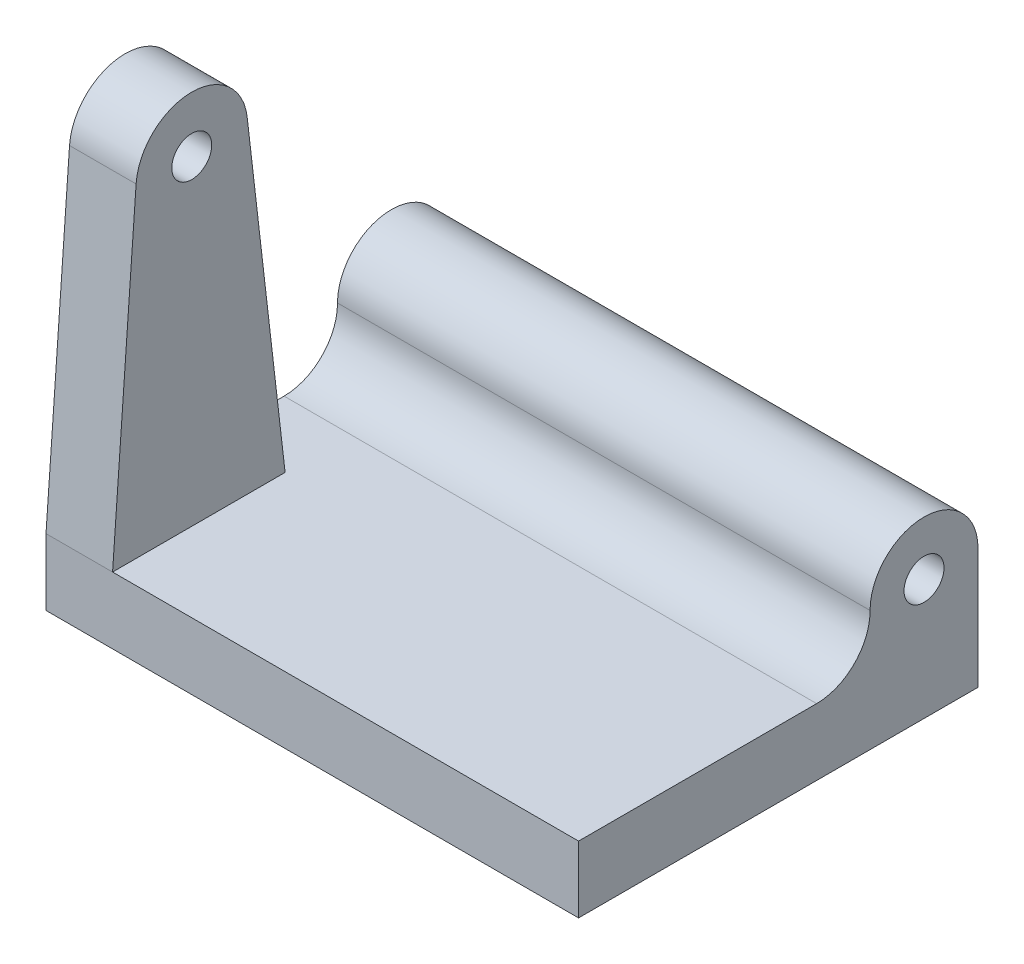
ISO-10303-21;
HEADER;
FILE_DESCRIPTION(('STEP AP214'),'2;1');
FILE_NAME('part.step','',(''),(''),'','','');
FILE_SCHEMA(('AUTOMOTIVE_DESIGN { 1 0 10303 214 1 1 1 1 }'));
ENDSEC;
DATA;
#1=APPLICATION_CONTEXT('core data for automotive mechanical design processes');
#2=APPLICATION_PROTOCOL_DEFINITION('international standard','automotive_design',2000,#1);
#3=PRODUCT_CONTEXT('',#1,'mechanical');
#4=PRODUCT('Part','Part','',(#3));
#5=PRODUCT_RELATED_PRODUCT_CATEGORY('part','',(#4));
#6=PRODUCT_DEFINITION_FORMATION('','',#4);
#7=PRODUCT_DEFINITION_CONTEXT('part definition',#1,'design');
#8=PRODUCT_DEFINITION('design','',#6,#7);
#9=PRODUCT_DEFINITION_SHAPE('','',#8);
#10=(LENGTH_UNIT() NAMED_UNIT(*) SI_UNIT(.MILLI.,.METRE.));
#11=(NAMED_UNIT(*) PLANE_ANGLE_UNIT() SI_UNIT($,.RADIAN.));
#12=(NAMED_UNIT(*) SI_UNIT($,.STERADIAN.) SOLID_ANGLE_UNIT());
#13=UNCERTAINTY_MEASURE_WITH_UNIT(LENGTH_MEASURE(1.E-05),#10,'distance_accuracy_value','');
#14=(GEOMETRIC_REPRESENTATION_CONTEXT(3) GLOBAL_UNCERTAINTY_ASSIGNED_CONTEXT((#13)) GLOBAL_UNIT_ASSIGNED_CONTEXT((#10,
#11,#12)) REPRESENTATION_CONTEXT('',''));
#15=CARTESIAN_POINT('',(0.,0.,0.));
#16=DIRECTION('',(0.,0.,1.));
#17=DIRECTION('',(1.,0.,0.));
#18=AXIS2_PLACEMENT_3D('',#15,#16,#17);
#19=CARTESIAN_POINT('',(0.,5.,0.));
#20=DIRECTION('',(0.,1.,0.));
#21=DIRECTION('',(0.,0.,1.));
#22=AXIS2_PLACEMENT_3D('',#19,#20,#21);
#23=PLANE('',#22);
#24=DIRECTION('',(-1.,0.,0.));
#25=VECTOR('',#24,1.);
#26=CARTESIAN_POINT('',(5.,5.,17.0414628370139));
#27=LINE('',#26,#25);
#28=CARTESIAN_POINT('',(5.,5.,17.0414628370139));
#29=VERTEX_POINT('',#28);
#30=CARTESIAN_POINT('',(0.,5.,17.0414628370139));
#31=VERTEX_POINT('',#30);
#32=EDGE_CURVE('E52',#29,#31,#27,.T.);
#33=ORIENTED_EDGE('',*,*,#32,.F.);
#34=DIRECTION('',(0.,0.,1.));
#35=VECTOR('',#34,1.);
#36=CARTESIAN_POINT('',(5.,5.,17.0414628370139));
#37=LINE('',#36,#35);
#38=CARTESIAN_POINT('',(5.,5.,30.));
#39=VERTEX_POINT('',#38);
#40=EDGE_CURVE('E119',#29,#39,#37,.T.);
#41=ORIENTED_EDGE('',*,*,#40,.T.);
#42=DIRECTION('',(1.,0.,0.));
#43=VECTOR('',#42,1.);
#44=CARTESIAN_POINT('',(0.,5.,30.));
#45=LINE('',#44,#43);
#46=CARTESIAN_POINT('',(40.,5.,30.));
#47=VERTEX_POINT('',#46);
#48=EDGE_CURVE('E110',#39,#47,#45,.T.);
#49=ORIENTED_EDGE('',*,*,#48,.T.);
#50=DIRECTION('',(0.,0.,-1.));
#51=VECTOR('',#50,1.);
#52=CARTESIAN_POINT('',(40.,5.,0.));
#53=LINE('',#52,#51);
#54=CARTESIAN_POINT('',(40.,5.,12.1169309093559));
#55=VERTEX_POINT('',#54);
#56=EDGE_CURVE('E133',#47,#55,#53,.T.);
#57=ORIENTED_EDGE('',*,*,#56,.T.);
#58=DIRECTION('',(-1.,0.,0.));
#59=VECTOR('',#58,1.);
#60=CARTESIAN_POINT('',(40.,5.,12.1169309093559));
#61=LINE('',#60,#59);
#62=CARTESIAN_POINT('',(0.,5.,12.1169309093559));
#63=VERTEX_POINT('',#62);
#64=EDGE_CURVE('E176',#55,#63,#61,.T.);
#65=ORIENTED_EDGE('',*,*,#64,.T.);
#66=DIRECTION('',(0.,0.,1.));
#67=VECTOR('',#66,1.);
#68=CARTESIAN_POINT('',(0.,5.,0.));
#69=LINE('',#68,#67);
#70=EDGE_CURVE('E57',#63,#31,#69,.T.);
#71=ORIENTED_EDGE('',*,*,#70,.T.);
#72=EDGE_LOOP('',(#33,#41,#49,#57,#65,#71));
#73=FACE_BOUND('',#72,.T.);
#74=ADVANCED_FACE('F35',(#73),#23,.T.);
#75=CARTESIAN_POINT('',(0.,5.,0.));
#76=DIRECTION('',(1.,0.,0.));
#77=DIRECTION('',(0.,0.,-1.));
#78=AXIS2_PLACEMENT_3D('',#75,#76,#77);
#79=PLANE('',#78);
#80=DIRECTION('',(0.,0.,1.));
#81=VECTOR('',#80,1.);
#82=CARTESIAN_POINT('',(0.,0.,0.));
#83=LINE('',#82,#81);
#84=CARTESIAN_POINT('',(0.,0.,0.));
#85=VERTEX_POINT('',#84);
#86=CARTESIAN_POINT('',(0.,0.,30.));
#87=VERTEX_POINT('',#86);
#88=EDGE_CURVE('E178',#85,#87,#83,.T.);
#89=ORIENTED_EDGE('',*,*,#88,.T.);
#90=DIRECTION('',(0.,-1.,0.));
#91=VECTOR('',#90,1.);
#92=CARTESIAN_POINT('',(0.,5.,30.));
#93=LINE('',#92,#91);
#94=CARTESIAN_POINT('',(0.,5.,30.));
#95=VERTEX_POINT('',#94);
#96=EDGE_CURVE('E11',#95,#87,#93,.T.);
#97=ORIENTED_EDGE('',*,*,#96,.F.);
#98=DIRECTION('',(0.,0.997378081158189,-0.0723668655201374));
#99=VECTOR('',#98,1.);
#100=CARTESIAN_POINT('',(0.,5.,30.));
#101=LINE('',#100,#99);
#102=CARTESIAN_POINT('',(0.,29.3577172886557,28.232674564736));
#103=VERTEX_POINT('',#102);
#104=EDGE_CURVE('E132',#95,#103,#101,.T.);
#105=ORIENTED_EDGE('',*,*,#104,.T.);
#106=CARTESIAN_POINT('',(0.,29.0544773857611,24.0533470464607));
#107=DIRECTION('',(-1.,0.,0.));
#108=DIRECTION('',(0.,0.,1.));
#109=AXIS2_PLACEMENT_3D('',#106,#107,#108);
#110=CIRCLE('',#109,4.19031418198219);
#111=CARTESIAN_POINT('',(0.,29.5378437926571,19.8910051743404));
#112=VERTEX_POINT('',#111);
#113=EDGE_CURVE('E146',#103,#112,#110,.T.);
#114=ORIENTED_EDGE('',*,*,#113,.T.);
#115=DIRECTION('',(0.,-0.993324531610965,-0.115353261331686));
#116=VECTOR('',#115,1.);
#117=CARTESIAN_POINT('',(0.,29.5378437926571,19.8910051743404));
#118=LINE('',#117,#116);
#119=EDGE_CURVE('E125',#112,#31,#118,.T.);
#120=ORIENTED_EDGE('',*,*,#119,.T.);
#121=ORIENTED_EDGE('',*,*,#70,.F.);
#122=CARTESIAN_POINT('',(0.,9.03235710109781,12.1390511940191));
#123=DIRECTION('',(-1.,0.,0.));
#124=DIRECTION('',(0.,0.,1.));
#125=AXIS2_PLACEMENT_3D('',#122,#123,#124);
#126=CIRCLE('',#125,4.03241777321839);
#127=CARTESIAN_POINT('',(0.,9.05447738576114,8.10669409292134));
#128=VERTEX_POINT('',#127);
#129=EDGE_CURVE('E153',#128,#63,#126,.T.);
#130=ORIENTED_EDGE('',*,*,#129,.F.);
#131=CARTESIAN_POINT('',(0.,9.05447738576107,4.05334704646067));
#132=DIRECTION('',(-1.,0.,0.));
#133=DIRECTION('',(0.,0.,1.));
#134=AXIS2_PLACEMENT_3D('',#131,#132,#133);
#135=CIRCLE('',#134,4.05334704646067);
#136=CARTESIAN_POINT('',(0.,9.05447738576107,0.));
#137=VERTEX_POINT('',#136);
#138=EDGE_CURVE('E165',#128,#137,#135,.T.);
#139=ORIENTED_EDGE('',*,*,#138,.T.);
#140=DIRECTION('',(0.,-1.,0.));
#141=VECTOR('',#140,1.);
#142=CARTESIAN_POINT('',(0.,5.,0.));
#143=LINE('',#142,#141);
#144=EDGE_CURVE('E190',#137,#85,#143,.T.);
#145=ORIENTED_EDGE('',*,*,#144,.T.);
#146=EDGE_LOOP('',(#89,#97,#105,#114,#120,#121,#130,#139,#145));
#147=FACE_BOUND('',#146,.T.);
#148=CARTESIAN_POINT('',(0.,9.05447738576107,4.05334704646067));
#149=DIRECTION('',(-1.,0.,0.));
#150=DIRECTION('',(0.,0.,1.));
#151=AXIS2_PLACEMENT_3D('',#148,#149,#150);
#152=CIRCLE('',#151,1.5);
#153=CARTESIAN_POINT('',(0.,9.05447738576107,5.55334704646067));
#154=VERTEX_POINT('',#153);
#155=EDGE_CURVE('E168',#154,#154,#152,.T.);
#156=ORIENTED_EDGE('',*,*,#155,.F.);
#157=EDGE_LOOP('',(#156));
#158=FACE_BOUND('',#157,.T.);
#159=CARTESIAN_POINT('',(0.,29.0544773857611,24.0533470464607));
#160=DIRECTION('',(-1.,0.,0.));
#161=DIRECTION('',(0.,0.,1.));
#162=AXIS2_PLACEMENT_3D('',#159,#160,#161);
#163=CIRCLE('',#162,1.5);
#164=CARTESIAN_POINT('',(0.,29.0544773857611,25.5533470464607));
#165=VERTEX_POINT('',#164);
#166=EDGE_CURVE('E345',#165,#165,#163,.T.);
#167=ORIENTED_EDGE('',*,*,#166,.F.);
#168=EDGE_LOOP('',(#167));
#169=FACE_BOUND('',#168,.T.);
#170=ADVANCED_FACE('F37',(#147,#158,#169),#79,.F.);
#171=CARTESIAN_POINT('',(0.,5.,30.));
#172=DIRECTION('',(0.,0.,-1.));
#173=DIRECTION('',(-1.,0.,0.));
#174=AXIS2_PLACEMENT_3D('',#171,#172,#173);
#175=PLANE('',#174);
#176=DIRECTION('',(1.,0.,0.));
#177=VECTOR('',#176,1.);
#178=CARTESIAN_POINT('',(0.,0.,30.));
#179=LINE('',#178,#177);
#180=CARTESIAN_POINT('',(40.,0.,30.));
#181=VERTEX_POINT('',#180);
#182=EDGE_CURVE('E202',#87,#181,#179,.T.);
#183=ORIENTED_EDGE('',*,*,#182,.T.);
#184=DIRECTION('',(0.,-1.,0.));
#185=VECTOR('',#184,1.);
#186=CARTESIAN_POINT('',(40.,5.,30.));
#187=LINE('',#186,#185);
#188=EDGE_CURVE('E44',#47,#181,#187,.T.);
#189=ORIENTED_EDGE('',*,*,#188,.F.);
#190=ORIENTED_EDGE('',*,*,#48,.F.);
#191=EDGE_CURVE('E113',#95,#39,#45,.T.);
#192=ORIENTED_EDGE('',*,*,#191,.F.);
#193=ORIENTED_EDGE('',*,*,#96,.T.);
#194=EDGE_LOOP('',(#183,#189,#190,#192,#193));
#195=FACE_BOUND('',#194,.T.);
#196=ADVANCED_FACE('F111',(#195),#175,.F.);
#197=CARTESIAN_POINT('',(40.,5.,0.));
#198=DIRECTION('',(-1.,0.,0.));
#199=DIRECTION('',(0.,0.,1.));
#200=AXIS2_PLACEMENT_3D('',#197,#198,#199);
#201=PLANE('',#200);
#202=DIRECTION('',(0.,0.,-1.));
#203=VECTOR('',#202,1.);
#204=CARTESIAN_POINT('',(40.,0.,0.));
#205=LINE('',#204,#203);
#206=CARTESIAN_POINT('',(40.,0.,0.));
#207=VERTEX_POINT('',#206);
#208=EDGE_CURVE('E204',#181,#207,#205,.T.);
#209=ORIENTED_EDGE('',*,*,#208,.T.);
#210=DIRECTION('',(0.,-1.,0.));
#211=VECTOR('',#210,1.);
#212=CARTESIAN_POINT('',(40.,5.,0.));
#213=LINE('',#212,#211);
#214=CARTESIAN_POINT('',(40.,9.05447738576107,0.));
#215=VERTEX_POINT('',#214);
#216=EDGE_CURVE('E193',#215,#207,#213,.T.);
#217=ORIENTED_EDGE('',*,*,#216,.F.);
#218=CARTESIAN_POINT('',(40.,9.05447738576107,4.05334704646067));
#219=DIRECTION('',(-1.,0.,0.));
#220=DIRECTION('',(0.,0.,1.));
#221=AXIS2_PLACEMENT_3D('',#218,#219,#220);
#222=CIRCLE('',#221,4.05334704646067);
#223=CARTESIAN_POINT('',(40.,9.05447738576114,8.10669409292134));
#224=VERTEX_POINT('',#223);
#225=EDGE_CURVE('E157',#224,#215,#222,.T.);
#226=ORIENTED_EDGE('',*,*,#225,.F.);
#227=CARTESIAN_POINT('',(40.,9.03235710109781,12.1390511940191));
#228=DIRECTION('',(-1.,0.,0.));
#229=DIRECTION('',(0.,0.,1.));
#230=AXIS2_PLACEMENT_3D('',#227,#228,#229);
#231=CIRCLE('',#230,4.03241777321839);
#232=EDGE_CURVE('E161',#224,#55,#231,.T.);
#233=ORIENTED_EDGE('',*,*,#232,.T.);
#234=ORIENTED_EDGE('',*,*,#56,.F.);
#235=ORIENTED_EDGE('',*,*,#188,.T.);
#236=EDGE_LOOP('',(#209,#217,#226,#233,#234,#235));
#237=FACE_BOUND('',#236,.T.);
#238=CARTESIAN_POINT('',(40.,9.05447738576107,4.05334704646067));
#239=DIRECTION('',(-1.,0.,0.));
#240=DIRECTION('',(0.,0.,1.));
#241=AXIS2_PLACEMENT_3D('',#238,#239,#240);
#242=CIRCLE('',#241,1.5);
#243=CARTESIAN_POINT('',(40.,9.05447738576107,5.55334704646067));
#244=VERTEX_POINT('',#243);
#245=EDGE_CURVE('E160',#244,#244,#242,.T.);
#246=ORIENTED_EDGE('',*,*,#245,.T.);
#247=EDGE_LOOP('',(#246));
#248=FACE_BOUND('',#247,.T.);
#249=ADVANCED_FACE('F185',(#237,#248),#201,.F.);
#250=CARTESIAN_POINT('',(0.,5.,0.));
#251=DIRECTION('',(0.,0.,1.));
#252=DIRECTION('',(1.,0.,0.));
#253=AXIS2_PLACEMENT_3D('',#250,#251,#252);
#254=PLANE('',#253);
#255=DIRECTION('',(-1.,0.,0.));
#256=VECTOR('',#255,1.);
#257=CARTESIAN_POINT('',(0.,0.,0.));
#258=LINE('',#257,#256);
#259=EDGE_CURVE('E206',#207,#85,#258,.T.);
#260=ORIENTED_EDGE('',*,*,#259,.T.);
#261=ORIENTED_EDGE('',*,*,#144,.F.);
#262=DIRECTION('',(-1.,0.,0.));
#263=VECTOR('',#262,1.);
#264=CARTESIAN_POINT('',(40.,9.05447738576107,0.));
#265=LINE('',#264,#263);
#266=EDGE_CURVE('E173',#215,#137,#265,.T.);
#267=ORIENTED_EDGE('',*,*,#266,.F.);
#268=ORIENTED_EDGE('',*,*,#216,.T.);
#269=EDGE_LOOP('',(#260,#261,#267,#268));
#270=FACE_BOUND('',#269,.T.);
#271=ADVANCED_FACE('F216',(#270),#254,.F.);
#272=CARTESIAN_POINT('',(0.,0.,0.));
#273=DIRECTION('',(0.,1.,0.));
#274=DIRECTION('',(0.,0.,1.));
#275=AXIS2_PLACEMENT_3D('',#272,#273,#274);
#276=PLANE('',#275);
#277=ORIENTED_EDGE('',*,*,#88,.F.);
#278=ORIENTED_EDGE('',*,*,#259,.F.);
#279=ORIENTED_EDGE('',*,*,#208,.F.);
#280=ORIENTED_EDGE('',*,*,#182,.F.);
#281=EDGE_LOOP('',(#277,#278,#279,#280));
#282=FACE_BOUND('',#281,.T.);
#283=ADVANCED_FACE('F214',(#282),#276,.F.);
#284=CARTESIAN_POINT('',(40.,9.03235710109781,12.1390511940191));
#285=DIRECTION('',(-1.,0.,0.));
#286=DIRECTION('',(0.,0.,1.));
#287=AXIS2_PLACEMENT_3D('',#284,#285,#286);
#288=CYLINDRICAL_SURFACE('',#287,4.03241777321839);
#289=ORIENTED_EDGE('',*,*,#129,.T.);
#290=ORIENTED_EDGE('',*,*,#64,.F.);
#291=ORIENTED_EDGE('',*,*,#232,.F.);
#292=DIRECTION('',(-1.,0.,0.));
#293=VECTOR('',#292,1.);
#294=CARTESIAN_POINT('',(40.,9.05447738576114,8.10669409292134));
#295=LINE('',#294,#293);
#296=EDGE_CURVE('E164',#224,#128,#295,.T.);
#297=ORIENTED_EDGE('',*,*,#296,.T.);
#298=EDGE_LOOP('',(#289,#290,#291,#297));
#299=FACE_BOUND('',#298,.T.);
#300=ADVANCED_FACE('F188',(#299),#288,.F.);
#301=CARTESIAN_POINT('',(40.,9.05447738576107,4.05334704646067));
#302=DIRECTION('',(-1.,0.,0.));
#303=DIRECTION('',(0.,0.,1.));
#304=AXIS2_PLACEMENT_3D('',#301,#302,#303);
#305=CYLINDRICAL_SURFACE('',#304,4.05334704646067);
#306=ORIENTED_EDGE('',*,*,#138,.F.);
#307=ORIENTED_EDGE('',*,*,#296,.F.);
#308=ORIENTED_EDGE('',*,*,#225,.T.);
#309=ORIENTED_EDGE('',*,*,#266,.T.);
#310=EDGE_LOOP('',(#306,#307,#308,#309));
#311=FACE_BOUND('',#310,.T.);
#312=ADVANCED_FACE('F223',(#311),#305,.T.);
#313=CARTESIAN_POINT('',(40.,9.05447738576107,4.05334704646067));
#314=DIRECTION('',(-1.,0.,0.));
#315=DIRECTION('',(0.,0.,1.));
#316=AXIS2_PLACEMENT_3D('',#313,#314,#315);
#317=CYLINDRICAL_SURFACE('',#316,1.5);
#318=ORIENTED_EDGE('',*,*,#245,.F.);
#319=EDGE_LOOP('',(#318));
#320=FACE_BOUND('',#319,.T.);
#321=ORIENTED_EDGE('',*,*,#155,.T.);
#322=EDGE_LOOP('',(#321));
#323=FACE_BOUND('',#322,.T.);
#324=ADVANCED_FACE('F226',(#320,#323),#317,.F.);
#325=CARTESIAN_POINT('',(5.,29.5378437926571,19.8910051743404));
#326=DIRECTION('',(0.,0.115353261331686,-0.993324531610965));
#327=DIRECTION('',(0.,0.993324531610965,0.115353261331686));
#328=AXIS2_PLACEMENT_3D('',#325,#326,#327);
#329=PLANE('',#328);
#330=ORIENTED_EDGE('',*,*,#119,.F.);
#331=DIRECTION('',(-1.,0.,0.));
#332=VECTOR('',#331,1.);
#333=CARTESIAN_POINT('',(5.,29.5378437926571,19.8910051743404));
#334=LINE('',#333,#332);
#335=CARTESIAN_POINT('',(5.,29.5378437926571,19.8910051743404));
#336=VERTEX_POINT('',#335);
#337=EDGE_CURVE('E154',#336,#112,#334,.T.);
#338=ORIENTED_EDGE('',*,*,#337,.F.);
#339=DIRECTION('',(0.,-0.993324531610965,-0.115353261331686));
#340=VECTOR('',#339,1.);
#341=CARTESIAN_POINT('',(5.,29.5378437926571,19.8910051743404));
#342=LINE('',#341,#340);
#343=EDGE_CURVE('E139',#336,#29,#342,.T.);
#344=ORIENTED_EDGE('',*,*,#343,.T.);
#345=ORIENTED_EDGE('',*,*,#32,.T.);
#346=EDGE_LOOP('',(#330,#338,#344,#345));
#347=FACE_BOUND('',#346,.T.);
#348=ADVANCED_FACE('F232',(#347),#329,.T.);
#349=CARTESIAN_POINT('',(5.,29.0544773857611,24.0533470464607));
#350=DIRECTION('',(-1.,0.,0.));
#351=DIRECTION('',(0.,0.,1.));
#352=AXIS2_PLACEMENT_3D('',#349,#350,#351);
#353=CYLINDRICAL_SURFACE('',#352,4.19031418198219);
#354=ORIENTED_EDGE('',*,*,#113,.F.);
#355=DIRECTION('',(-1.,0.,0.));
#356=VECTOR('',#355,1.);
#357=CARTESIAN_POINT('',(5.,29.3577172886557,28.232674564736));
#358=LINE('',#357,#356);
#359=CARTESIAN_POINT('',(5.,29.3577172886557,28.232674564736));
#360=VERTEX_POINT('',#359);
#361=EDGE_CURVE('E144',#360,#103,#358,.T.);
#362=ORIENTED_EDGE('',*,*,#361,.F.);
#363=CARTESIAN_POINT('',(5.,29.0544773857611,24.0533470464607));
#364=DIRECTION('',(-1.,0.,0.));
#365=DIRECTION('',(0.,0.,1.));
#366=AXIS2_PLACEMENT_3D('',#363,#364,#365);
#367=CIRCLE('',#366,4.19031418198219);
#368=EDGE_CURVE('E137',#360,#336,#367,.T.);
#369=ORIENTED_EDGE('',*,*,#368,.T.);
#370=ORIENTED_EDGE('',*,*,#337,.T.);
#371=EDGE_LOOP('',(#354,#362,#369,#370));
#372=FACE_BOUND('',#371,.T.);
#373=ADVANCED_FACE('F300',(#372),#353,.T.);
#374=CARTESIAN_POINT('',(5.,5.,30.));
#375=DIRECTION('',(0.,0.0723668655201374,0.997378081158189));
#376=DIRECTION('',(0.,-0.997378081158189,0.0723668655201374));
#377=AXIS2_PLACEMENT_3D('',#374,#375,#376);
#378=PLANE('',#377);
#379=ORIENTED_EDGE('',*,*,#104,.F.);
#380=ORIENTED_EDGE('',*,*,#191,.T.);
#381=DIRECTION('',(0.,0.997378081158189,-0.0723668655201374));
#382=VECTOR('',#381,1.);
#383=CARTESIAN_POINT('',(5.,5.,30.));
#384=LINE('',#383,#382);
#385=EDGE_CURVE('E124',#39,#360,#384,.T.);
#386=ORIENTED_EDGE('',*,*,#385,.T.);
#387=ORIENTED_EDGE('',*,*,#361,.T.);
#388=EDGE_LOOP('',(#379,#380,#386,#387));
#389=FACE_BOUND('',#388,.T.);
#390=ADVANCED_FACE('F130',(#389),#378,.T.);
#391=CARTESIAN_POINT('',(5.,29.0544773857611,24.0533470464607));
#392=DIRECTION('',(-1.,0.,0.));
#393=DIRECTION('',(0.,0.,1.));
#394=AXIS2_PLACEMENT_3D('',#391,#392,#393);
#395=PLANE('',#394);
#396=CARTESIAN_POINT('',(5.,29.0544773857611,24.0533470464607));
#397=DIRECTION('',(-1.,0.,0.));
#398=DIRECTION('',(0.,0.,1.));
#399=AXIS2_PLACEMENT_3D('',#396,#397,#398);
#400=CIRCLE('',#399,1.5);
#401=CARTESIAN_POINT('',(5.,29.0544773857611,25.5533470464607));
#402=VERTEX_POINT('',#401);
#403=EDGE_CURVE('E147',#402,#402,#400,.T.);
#404=ORIENTED_EDGE('',*,*,#403,.T.);
#405=EDGE_LOOP('',(#404));
#406=FACE_BOUND('',#405,.T.);
#407=ORIENTED_EDGE('',*,*,#40,.F.);
#408=ORIENTED_EDGE('',*,*,#343,.F.);
#409=ORIENTED_EDGE('',*,*,#368,.F.);
#410=ORIENTED_EDGE('',*,*,#385,.F.);
#411=EDGE_LOOP('',(#407,#408,#409,#410));
#412=FACE_BOUND('',#411,.T.);
#413=ADVANCED_FACE('F135',(#406,#412),#395,.F.);
#414=CARTESIAN_POINT('',(5.,29.0544773857611,24.0533470464607));
#415=DIRECTION('',(-1.,0.,0.));
#416=DIRECTION('',(0.,0.,1.));
#417=AXIS2_PLACEMENT_3D('',#414,#415,#416);
#418=CYLINDRICAL_SURFACE('',#417,1.5);
#419=ORIENTED_EDGE('',*,*,#403,.F.);
#420=EDGE_LOOP('',(#419));
#421=FACE_BOUND('',#420,.T.);
#422=ORIENTED_EDGE('',*,*,#166,.T.);
#423=EDGE_LOOP('',(#422));
#424=FACE_BOUND('',#423,.T.);
#425=ADVANCED_FACE('F324',(#421,#424),#418,.F.);
#426=CLOSED_SHELL('',(#74,#170,#196,#249,#271,#283,#300,#312,#324,#348,#373,#390,#413,#425));
#427=MANIFOLD_SOLID_BREP('B2',#426);
#428=ADVANCED_BREP_SHAPE_REPRESENTATION('',(#18,#427),#14);
#429=SHAPE_DEFINITION_REPRESENTATION(#9,#428);
ENDSEC;
END-ISO-10303-21;
